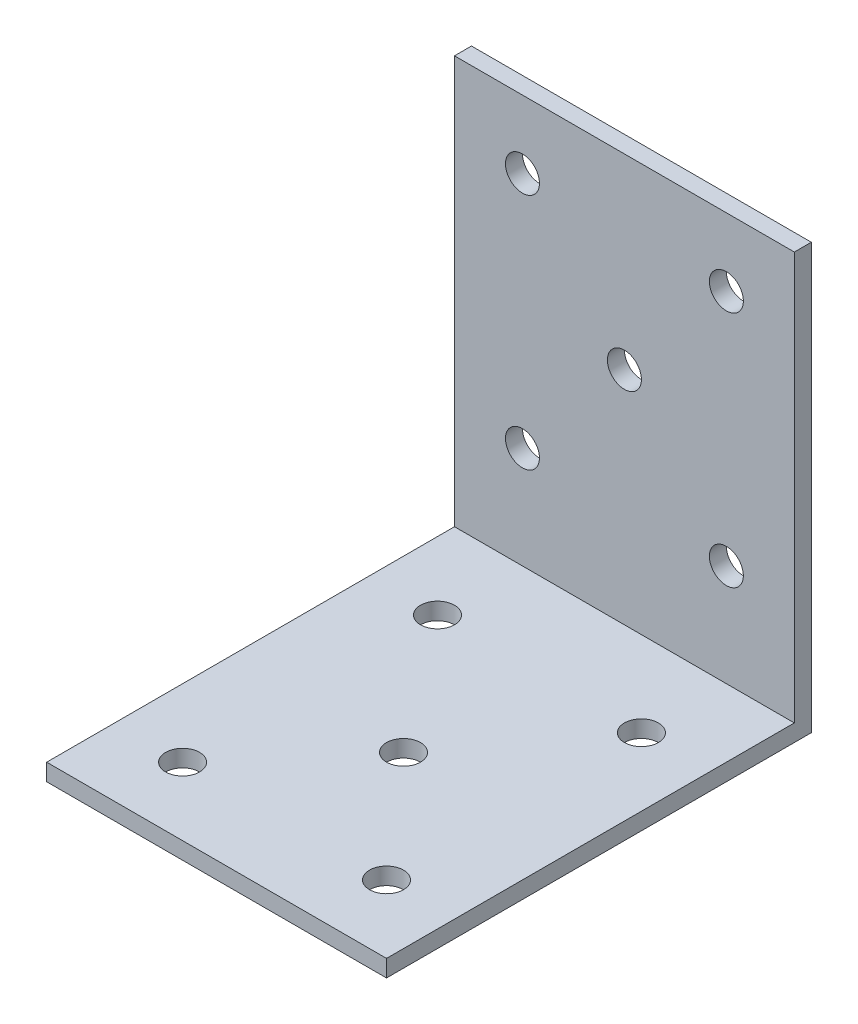
ISO-10303-21;
HEADER;
FILE_DESCRIPTION(('STEP AP214'),'2;1');
FILE_NAME('part.step','',(''),(''),'','','');
FILE_SCHEMA(('AUTOMOTIVE_DESIGN { 1 0 10303 214 1 1 1 1 }'));
ENDSEC;
DATA;
#1=APPLICATION_CONTEXT('core data for automotive mechanical design processes');
#2=APPLICATION_PROTOCOL_DEFINITION('international standard','automotive_design',2000,#1);
#3=PRODUCT_CONTEXT('',#1,'mechanical');
#4=PRODUCT('Part','Part','',(#3));
#5=PRODUCT_RELATED_PRODUCT_CATEGORY('part','',(#4));
#6=PRODUCT_DEFINITION_FORMATION('','',#4);
#7=PRODUCT_DEFINITION_CONTEXT('part definition',#1,'design');
#8=PRODUCT_DEFINITION('design','',#6,#7);
#9=PRODUCT_DEFINITION_SHAPE('','',#8);
#10=(LENGTH_UNIT() NAMED_UNIT(*) SI_UNIT(.MILLI.,.METRE.));
#11=(NAMED_UNIT(*) PLANE_ANGLE_UNIT() SI_UNIT($,.RADIAN.));
#12=(NAMED_UNIT(*) SI_UNIT($,.STERADIAN.) SOLID_ANGLE_UNIT());
#13=UNCERTAINTY_MEASURE_WITH_UNIT(LENGTH_MEASURE(1.E-05),#10,'distance_accuracy_value','');
#14=(GEOMETRIC_REPRESENTATION_CONTEXT(3) GLOBAL_UNCERTAINTY_ASSIGNED_CONTEXT((#13)) GLOBAL_UNIT_ASSIGNED_CONTEXT((#10,
#11,#12)) REPRESENTATION_CONTEXT('',''));
#15=CARTESIAN_POINT('',(0.,0.,0.));
#16=DIRECTION('',(0.,0.,1.));
#17=DIRECTION('',(1.,0.,0.));
#18=AXIS2_PLACEMENT_3D('',#15,#16,#17);
#19=CARTESIAN_POINT('',(0.,2.,0.));
#20=DIRECTION('',(0.,1.,0.));
#21=DIRECTION('',(0.,0.,1.));
#22=AXIS2_PLACEMENT_3D('',#19,#20,#21);
#23=PLANE('',#22);
#24=CARTESIAN_POINT('',(12.,2.,-16.));
#25=DIRECTION('',(0.,1.,0.));
#26=DIRECTION('',(0.,0.,1.));
#27=AXIS2_PLACEMENT_3D('',#24,#25,#26);
#28=CIRCLE('',#27,2.);
#29=CARTESIAN_POINT('',(12.,2.,-14.));
#30=VERTEX_POINT('',#29);
#31=EDGE_CURVE('E129',#30,#30,#28,.T.);
#32=ORIENTED_EDGE('',*,*,#31,.F.);
#33=EDGE_LOOP('',(#32));
#34=FACE_BOUND('',#33,.T.);
#35=CARTESIAN_POINT('',(-12.,2.,14.));
#36=DIRECTION('',(0.,1.,0.));
#37=DIRECTION('',(0.,0.,1.));
#38=AXIS2_PLACEMENT_3D('',#35,#36,#37);
#39=CIRCLE('',#38,2.);
#40=CARTESIAN_POINT('',(-12.,2.,16.));
#41=VERTEX_POINT('',#40);
#42=EDGE_CURVE('E141',#41,#41,#39,.T.);
#43=ORIENTED_EDGE('',*,*,#42,.F.);
#44=EDGE_LOOP('',(#43));
#45=FACE_BOUND('',#44,.T.);
#46=CARTESIAN_POINT('',(0.,2.,0.));
#47=DIRECTION('',(0.,1.,0.));
#48=DIRECTION('',(0.,0.,1.));
#49=AXIS2_PLACEMENT_3D('',#46,#47,#48);
#50=CIRCLE('',#49,2.);
#51=CARTESIAN_POINT('',(0.,2.,2.));
#52=VERTEX_POINT('',#51);
#53=EDGE_CURVE('E147',#52,#52,#50,.T.);
#54=ORIENTED_EDGE('',*,*,#53,.F.);
#55=EDGE_LOOP('',(#54));
#56=FACE_BOUND('',#55,.T.);
#57=CARTESIAN_POINT('',(-12.,2.,-16.));
#58=DIRECTION('',(0.,1.,0.));
#59=DIRECTION('',(0.,0.,1.));
#60=AXIS2_PLACEMENT_3D('',#57,#58,#59);
#61=CIRCLE('',#60,2.);
#62=CARTESIAN_POINT('',(-12.,2.,-14.));
#63=VERTEX_POINT('',#62);
#64=EDGE_CURVE('E135',#63,#63,#61,.T.);
#65=ORIENTED_EDGE('',*,*,#64,.F.);
#66=EDGE_LOOP('',(#65));
#67=FACE_BOUND('',#66,.T.);
#68=CARTESIAN_POINT('',(12.,2.,14.));
#69=DIRECTION('',(0.,1.,0.));
#70=DIRECTION('',(0.,0.,1.));
#71=AXIS2_PLACEMENT_3D('',#68,#69,#70);
#72=CIRCLE('',#71,2.);
#73=CARTESIAN_POINT('',(12.,2.,16.));
#74=VERTEX_POINT('',#73);
#75=EDGE_CURVE('E123',#74,#74,#72,.T.);
#76=ORIENTED_EDGE('',*,*,#75,.F.);
#77=EDGE_LOOP('',(#76));
#78=FACE_BOUND('',#77,.T.);
#79=DIRECTION('',(0.,0.,-1.));
#80=VECTOR('',#79,1.);
#81=CARTESIAN_POINT('',(20.,2.,-28.));
#82=LINE('',#81,#80);
#83=CARTESIAN_POINT('',(20.,2.,22.));
#84=VERTEX_POINT('',#83);
#85=CARTESIAN_POINT('',(20.,2.,-26.));
#86=VERTEX_POINT('',#85);
#87=EDGE_CURVE('E59',#84,#86,#82,.T.);
#88=ORIENTED_EDGE('',*,*,#87,.T.);
#89=DIRECTION('',(-1.,0.,0.));
#90=VECTOR('',#89,1.);
#91=CARTESIAN_POINT('',(0.,2.,-26.));
#92=LINE('',#91,#90);
#93=CARTESIAN_POINT('',(-20.,2.,-26.));
#94=VERTEX_POINT('',#93);
#95=EDGE_CURVE('E54',#86,#94,#92,.T.);
#96=ORIENTED_EDGE('',*,*,#95,.T.);
#97=DIRECTION('',(0.,0.,1.));
#98=VECTOR('',#97,1.);
#99=CARTESIAN_POINT('',(-20.,2.,-28.));
#100=LINE('',#99,#98);
#101=CARTESIAN_POINT('',(-20.,2.,22.));
#102=VERTEX_POINT('',#101);
#103=EDGE_CURVE('E96',#94,#102,#100,.T.);
#104=ORIENTED_EDGE('',*,*,#103,.T.);
#105=DIRECTION('',(1.,0.,0.));
#106=VECTOR('',#105,1.);
#107=CARTESIAN_POINT('',(-20.,2.,22.));
#108=LINE('',#107,#106);
#109=EDGE_CURVE('E154',#102,#84,#108,.T.);
#110=ORIENTED_EDGE('',*,*,#109,.T.);
#111=EDGE_LOOP('',(#88,#96,#104,#110));
#112=FACE_BOUND('',#111,.T.);
#113=ADVANCED_FACE('F39',(#34,#45,#56,#67,#78,#112),#23,.T.);
#114=CARTESIAN_POINT('',(0.,0.,0.));
#115=DIRECTION('',(0.,1.,0.));
#116=DIRECTION('',(0.,0.,1.));
#117=AXIS2_PLACEMENT_3D('',#114,#115,#116);
#118=PLANE('',#117);
#119=DIRECTION('',(-1.,0.,0.));
#120=VECTOR('',#119,1.);
#121=CARTESIAN_POINT('',(-20.,0.,-28.));
#122=LINE('',#121,#120);
#123=CARTESIAN_POINT('',(20.,0.,-28.));
#124=VERTEX_POINT('',#123);
#125=CARTESIAN_POINT('',(-20.,0.,-28.));
#126=VERTEX_POINT('',#125);
#127=EDGE_CURVE('E155',#124,#126,#122,.T.);
#128=ORIENTED_EDGE('',*,*,#127,.F.);
#129=DIRECTION('',(0.,0.,-1.));
#130=VECTOR('',#129,1.);
#131=CARTESIAN_POINT('',(20.,0.,-28.));
#132=LINE('',#131,#130);
#133=CARTESIAN_POINT('',(20.,0.,22.));
#134=VERTEX_POINT('',#133);
#135=EDGE_CURVE('E162',#134,#124,#132,.T.);
#136=ORIENTED_EDGE('',*,*,#135,.F.);
#137=DIRECTION('',(1.,0.,0.));
#138=VECTOR('',#137,1.);
#139=CARTESIAN_POINT('',(-20.,0.,22.));
#140=LINE('',#139,#138);
#141=CARTESIAN_POINT('',(-20.,0.,22.));
#142=VERTEX_POINT('',#141);
#143=EDGE_CURVE('E160',#142,#134,#140,.T.);
#144=ORIENTED_EDGE('',*,*,#143,.F.);
#145=DIRECTION('',(0.,0.,1.));
#146=VECTOR('',#145,1.);
#147=CARTESIAN_POINT('',(-20.,0.,-28.));
#148=LINE('',#147,#146);
#149=EDGE_CURVE('E150',#126,#142,#148,.T.);
#150=ORIENTED_EDGE('',*,*,#149,.F.);
#151=EDGE_LOOP('',(#128,#136,#144,#150));
#152=FACE_BOUND('',#151,.T.);
#153=CARTESIAN_POINT('',(12.,0.,14.));
#154=DIRECTION('',(0.,1.,0.));
#155=DIRECTION('',(0.,0.,1.));
#156=AXIS2_PLACEMENT_3D('',#153,#154,#155);
#157=CIRCLE('',#156,2.);
#158=CARTESIAN_POINT('',(12.,0.,16.));
#159=VERTEX_POINT('',#158);
#160=EDGE_CURVE('E122',#159,#159,#157,.T.);
#161=ORIENTED_EDGE('',*,*,#160,.T.);
#162=EDGE_LOOP('',(#161));
#163=FACE_BOUND('',#162,.T.);
#164=CARTESIAN_POINT('',(12.,0.,-16.));
#165=DIRECTION('',(0.,1.,0.));
#166=DIRECTION('',(0.,0.,1.));
#167=AXIS2_PLACEMENT_3D('',#164,#165,#166);
#168=CIRCLE('',#167,2.);
#169=CARTESIAN_POINT('',(12.,0.,-14.));
#170=VERTEX_POINT('',#169);
#171=EDGE_CURVE('E126',#170,#170,#168,.T.);
#172=ORIENTED_EDGE('',*,*,#171,.T.);
#173=EDGE_LOOP('',(#172));
#174=FACE_BOUND('',#173,.T.);
#175=CARTESIAN_POINT('',(-12.,0.,-16.));
#176=DIRECTION('',(0.,1.,0.));
#177=DIRECTION('',(0.,0.,1.));
#178=AXIS2_PLACEMENT_3D('',#175,#176,#177);
#179=CIRCLE('',#178,2.);
#180=CARTESIAN_POINT('',(-12.,0.,-14.));
#181=VERTEX_POINT('',#180);
#182=EDGE_CURVE('E132',#181,#181,#179,.T.);
#183=ORIENTED_EDGE('',*,*,#182,.T.);
#184=EDGE_LOOP('',(#183));
#185=FACE_BOUND('',#184,.T.);
#186=CARTESIAN_POINT('',(-12.,0.,14.));
#187=DIRECTION('',(0.,1.,0.));
#188=DIRECTION('',(0.,0.,1.));
#189=AXIS2_PLACEMENT_3D('',#186,#187,#188);
#190=CIRCLE('',#189,2.);
#191=CARTESIAN_POINT('',(-12.,0.,16.));
#192=VERTEX_POINT('',#191);
#193=EDGE_CURVE('E138',#192,#192,#190,.T.);
#194=ORIENTED_EDGE('',*,*,#193,.T.);
#195=EDGE_LOOP('',(#194));
#196=FACE_BOUND('',#195,.T.);
#197=CARTESIAN_POINT('',(0.,0.,0.));
#198=DIRECTION('',(0.,1.,0.));
#199=DIRECTION('',(0.,0.,1.));
#200=AXIS2_PLACEMENT_3D('',#197,#198,#199);
#201=CIRCLE('',#200,2.);
#202=CARTESIAN_POINT('',(0.,0.,2.));
#203=VERTEX_POINT('',#202);
#204=EDGE_CURVE('E144',#203,#203,#201,.T.);
#205=ORIENTED_EDGE('',*,*,#204,.T.);
#206=EDGE_LOOP('',(#205));
#207=FACE_BOUND('',#206,.T.);
#208=ADVANCED_FACE('F178',(#152,#163,#174,#185,#196,#207),#118,.F.);
#209=CARTESIAN_POINT('',(-20.,2.,-28.));
#210=DIRECTION('',(1.,0.,0.));
#211=DIRECTION('',(0.,0.,-1.));
#212=AXIS2_PLACEMENT_3D('',#209,#210,#211);
#213=PLANE('',#212);
#214=ORIENTED_EDGE('',*,*,#149,.T.);
#215=DIRECTION('',(0.,-1.,0.));
#216=VECTOR('',#215,1.);
#217=CARTESIAN_POINT('',(-20.,2.,22.));
#218=LINE('',#217,#216);
#219=EDGE_CURVE('E11',#102,#142,#218,.T.);
#220=ORIENTED_EDGE('',*,*,#219,.F.);
#221=ORIENTED_EDGE('',*,*,#103,.F.);
#222=DIRECTION('',(0.,1.,0.));
#223=VECTOR('',#222,1.);
#224=CARTESIAN_POINT('',(-20.,0.,-26.));
#225=LINE('',#224,#223);
#226=CARTESIAN_POINT('',(-20.,50.,-26.));
#227=VERTEX_POINT('',#226);
#228=EDGE_CURVE('E90',#94,#227,#225,.T.);
#229=ORIENTED_EDGE('',*,*,#228,.T.);
#230=DIRECTION('',(0.,0.,-1.));
#231=VECTOR('',#230,1.);
#232=CARTESIAN_POINT('',(-20.,50.,-26.));
#233=LINE('',#232,#231);
#234=CARTESIAN_POINT('',(-20.,50.,-28.));
#235=VERTEX_POINT('',#234);
#236=EDGE_CURVE('E93',#227,#235,#233,.T.);
#237=ORIENTED_EDGE('',*,*,#236,.T.);
#238=DIRECTION('',(0.,-1.,0.));
#239=VECTOR('',#238,1.);
#240=CARTESIAN_POINT('',(-20.,2.,-28.));
#241=LINE('',#240,#239);
#242=EDGE_CURVE('E158',#235,#126,#241,.T.);
#243=ORIENTED_EDGE('',*,*,#242,.T.);
#244=EDGE_LOOP('',(#214,#220,#221,#229,#237,#243));
#245=FACE_BOUND('',#244,.T.);
#246=ADVANCED_FACE('F41',(#245),#213,.F.);
#247=CARTESIAN_POINT('',(-20.,2.,22.));
#248=DIRECTION('',(0.,0.,-1.));
#249=DIRECTION('',(-1.,0.,0.));
#250=AXIS2_PLACEMENT_3D('',#247,#248,#249);
#251=PLANE('',#250);
#252=ORIENTED_EDGE('',*,*,#143,.T.);
#253=DIRECTION('',(0.,-1.,0.));
#254=VECTOR('',#253,1.);
#255=CARTESIAN_POINT('',(20.,2.,22.));
#256=LINE('',#255,#254);
#257=EDGE_CURVE('E47',#84,#134,#256,.T.);
#258=ORIENTED_EDGE('',*,*,#257,.F.);
#259=ORIENTED_EDGE('',*,*,#109,.F.);
#260=ORIENTED_EDGE('',*,*,#219,.T.);
#261=EDGE_LOOP('',(#252,#258,#259,#260));
#262=FACE_BOUND('',#261,.T.);
#263=ADVANCED_FACE('F184',(#262),#251,.F.);
#264=CARTESIAN_POINT('',(20.,2.,-28.));
#265=DIRECTION('',(-1.,0.,0.));
#266=DIRECTION('',(0.,0.,1.));
#267=AXIS2_PLACEMENT_3D('',#264,#265,#266);
#268=PLANE('',#267);
#269=DIRECTION('',(0.,-1.,0.));
#270=VECTOR('',#269,1.);
#271=CARTESIAN_POINT('',(20.,2.,-28.));
#272=LINE('',#271,#270);
#273=CARTESIAN_POINT('',(20.,50.,-28.));
#274=VERTEX_POINT('',#273);
#275=EDGE_CURVE('E166',#274,#124,#272,.T.);
#276=ORIENTED_EDGE('',*,*,#275,.F.);
#277=DIRECTION('',(0.,0.,-1.));
#278=VECTOR('',#277,1.);
#279=CARTESIAN_POINT('',(20.,50.,-26.));
#280=LINE('',#279,#278);
#281=CARTESIAN_POINT('',(20.,50.,-26.));
#282=VERTEX_POINT('',#281);
#283=EDGE_CURVE('E107',#282,#274,#280,.T.);
#284=ORIENTED_EDGE('',*,*,#283,.F.);
#285=DIRECTION('',(0.,-1.,0.));
#286=VECTOR('',#285,1.);
#287=CARTESIAN_POINT('',(20.,0.,-26.));
#288=LINE('',#287,#286);
#289=EDGE_CURVE('E108',#282,#86,#288,.T.);
#290=ORIENTED_EDGE('',*,*,#289,.T.);
#291=ORIENTED_EDGE('',*,*,#87,.F.);
#292=ORIENTED_EDGE('',*,*,#257,.T.);
#293=ORIENTED_EDGE('',*,*,#135,.T.);
#294=EDGE_LOOP('',(#276,#284,#290,#291,#292,#293));
#295=FACE_BOUND('',#294,.T.);
#296=ADVANCED_FACE('F172',(#295),#268,.F.);
#297=CARTESIAN_POINT('',(-20.,2.,-28.));
#298=DIRECTION('',(0.,0.,1.));
#299=DIRECTION('',(1.,0.,0.));
#300=AXIS2_PLACEMENT_3D('',#297,#298,#299);
#301=PLANE('',#300);
#302=ORIENTED_EDGE('',*,*,#127,.T.);
#303=ORIENTED_EDGE('',*,*,#242,.F.);
#304=DIRECTION('',(1.,0.,0.));
#305=VECTOR('',#304,1.);
#306=CARTESIAN_POINT('',(-20.,50.,-28.));
#307=LINE('',#306,#305);
#308=EDGE_CURVE('E100',#235,#274,#307,.T.);
#309=ORIENTED_EDGE('',*,*,#308,.T.);
#310=ORIENTED_EDGE('',*,*,#275,.T.);
#311=EDGE_LOOP('',(#302,#303,#309,#310));
#312=FACE_BOUND('',#311,.T.);
#313=CARTESIAN_POINT('',(-12.,14.,-28.));
#314=DIRECTION('',(0.,0.,-1.));
#315=DIRECTION('',(-1.,0.,0.));
#316=AXIS2_PLACEMENT_3D('',#313,#314,#315);
#317=CIRCLE('',#316,2.);
#318=CARTESIAN_POINT('',(-14.,14.,-28.));
#319=VERTEX_POINT('',#318);
#320=EDGE_CURVE('E386',#319,#319,#317,.T.);
#321=ORIENTED_EDGE('',*,*,#320,.F.);
#322=EDGE_LOOP('',(#321));
#323=FACE_BOUND('',#322,.T.);
#324=CARTESIAN_POINT('',(12.,14.,-28.));
#325=DIRECTION('',(0.,0.,-1.));
#326=DIRECTION('',(-1.,0.,0.));
#327=AXIS2_PLACEMENT_3D('',#324,#325,#326);
#328=CIRCLE('',#327,2.);
#329=CARTESIAN_POINT('',(10.,14.,-28.));
#330=VERTEX_POINT('',#329);
#331=EDGE_CURVE('E388',#330,#330,#328,.T.);
#332=ORIENTED_EDGE('',*,*,#331,.F.);
#333=EDGE_LOOP('',(#332));
#334=FACE_BOUND('',#333,.T.);
#335=CARTESIAN_POINT('',(12.,42.,-28.));
#336=DIRECTION('',(0.,0.,-1.));
#337=DIRECTION('',(-1.,0.,0.));
#338=AXIS2_PLACEMENT_3D('',#335,#336,#337);
#339=CIRCLE('',#338,2.);
#340=CARTESIAN_POINT('',(10.,42.,-28.));
#341=VERTEX_POINT('',#340);
#342=EDGE_CURVE('E394',#341,#341,#339,.T.);
#343=ORIENTED_EDGE('',*,*,#342,.F.);
#344=EDGE_LOOP('',(#343));
#345=FACE_BOUND('',#344,.T.);
#346=CARTESIAN_POINT('',(-12.,42.,-28.));
#347=DIRECTION('',(0.,0.,-1.));
#348=DIRECTION('',(-1.,0.,0.));
#349=AXIS2_PLACEMENT_3D('',#346,#347,#348);
#350=CIRCLE('',#349,2.);
#351=CARTESIAN_POINT('',(-14.,42.,-28.));
#352=VERTEX_POINT('',#351);
#353=EDGE_CURVE('E400',#352,#352,#350,.T.);
#354=ORIENTED_EDGE('',*,*,#353,.F.);
#355=EDGE_LOOP('',(#354));
#356=FACE_BOUND('',#355,.T.);
#357=CARTESIAN_POINT('',(0.,28.,-28.));
#358=DIRECTION('',(0.,0.,-1.));
#359=DIRECTION('',(-1.,0.,0.));
#360=AXIS2_PLACEMENT_3D('',#357,#358,#359);
#361=CIRCLE('',#360,2.);
#362=CARTESIAN_POINT('',(-2.,28.,-28.));
#363=VERTEX_POINT('',#362);
#364=EDGE_CURVE('E406',#363,#363,#361,.T.);
#365=ORIENTED_EDGE('',*,*,#364,.F.);
#366=EDGE_LOOP('',(#365));
#367=FACE_BOUND('',#366,.T.);
#368=ADVANCED_FACE('F182',(#312,#323,#334,#345,#356,#367),#301,.F.);
#369=CARTESIAN_POINT('',(0.,2.,0.));
#370=DIRECTION('',(0.,-1.,0.));
#371=DIRECTION('',(0.,0.,-1.));
#372=AXIS2_PLACEMENT_3D('',#369,#370,#371);
#373=CYLINDRICAL_SURFACE('',#372,2.);
#374=ORIENTED_EDGE('',*,*,#53,.T.);
#375=EDGE_LOOP('',(#374));
#376=FACE_BOUND('',#375,.T.);
#377=ORIENTED_EDGE('',*,*,#204,.F.);
#378=EDGE_LOOP('',(#377));
#379=FACE_BOUND('',#378,.T.);
#380=ADVANCED_FACE('F196',(#376,#379),#373,.F.);
#381=CARTESIAN_POINT('',(-12.,2.,14.));
#382=DIRECTION('',(0.,-1.,0.));
#383=DIRECTION('',(0.,0.,-1.));
#384=AXIS2_PLACEMENT_3D('',#381,#382,#383);
#385=CYLINDRICAL_SURFACE('',#384,2.);
#386=ORIENTED_EDGE('',*,*,#42,.T.);
#387=EDGE_LOOP('',(#386));
#388=FACE_BOUND('',#387,.T.);
#389=ORIENTED_EDGE('',*,*,#193,.F.);
#390=EDGE_LOOP('',(#389));
#391=FACE_BOUND('',#390,.T.);
#392=ADVANCED_FACE('F317',(#388,#391),#385,.F.);
#393=CARTESIAN_POINT('',(-12.,2.,-16.));
#394=DIRECTION('',(0.,-1.,0.));
#395=DIRECTION('',(0.,0.,-1.));
#396=AXIS2_PLACEMENT_3D('',#393,#394,#395);
#397=CYLINDRICAL_SURFACE('',#396,2.);
#398=ORIENTED_EDGE('',*,*,#64,.T.);
#399=EDGE_LOOP('',(#398));
#400=FACE_BOUND('',#399,.T.);
#401=ORIENTED_EDGE('',*,*,#182,.F.);
#402=EDGE_LOOP('',(#401));
#403=FACE_BOUND('',#402,.T.);
#404=ADVANCED_FACE('F308',(#400,#403),#397,.F.);
#405=CARTESIAN_POINT('',(12.,2.,-16.));
#406=DIRECTION('',(0.,-1.,0.));
#407=DIRECTION('',(0.,0.,-1.));
#408=AXIS2_PLACEMENT_3D('',#405,#406,#407);
#409=CYLINDRICAL_SURFACE('',#408,2.);
#410=ORIENTED_EDGE('',*,*,#31,.T.);
#411=EDGE_LOOP('',(#410));
#412=FACE_BOUND('',#411,.T.);
#413=ORIENTED_EDGE('',*,*,#171,.F.);
#414=EDGE_LOOP('',(#413));
#415=FACE_BOUND('',#414,.T.);
#416=ADVANCED_FACE('F299',(#412,#415),#409,.F.);
#417=CARTESIAN_POINT('',(12.,2.,14.));
#418=DIRECTION('',(0.,-1.,0.));
#419=DIRECTION('',(0.,0.,-1.));
#420=AXIS2_PLACEMENT_3D('',#417,#418,#419);
#421=CYLINDRICAL_SURFACE('',#420,2.);
#422=ORIENTED_EDGE('',*,*,#75,.T.);
#423=EDGE_LOOP('',(#422));
#424=FACE_BOUND('',#423,.T.);
#425=ORIENTED_EDGE('',*,*,#160,.F.);
#426=EDGE_LOOP('',(#425));
#427=FACE_BOUND('',#426,.T.);
#428=ADVANCED_FACE('F229',(#424,#427),#421,.F.);
#429=CARTESIAN_POINT('',(-20.,50.,-26.));
#430=DIRECTION('',(0.,1.,0.));
#431=DIRECTION('',(0.,0.,1.));
#432=AXIS2_PLACEMENT_3D('',#429,#430,#431);
#433=PLANE('',#432);
#434=ORIENTED_EDGE('',*,*,#308,.F.);
#435=ORIENTED_EDGE('',*,*,#236,.F.);
#436=DIRECTION('',(1.,0.,0.));
#437=VECTOR('',#436,1.);
#438=CARTESIAN_POINT('',(-20.,50.,-26.));
#439=LINE('',#438,#437);
#440=EDGE_CURVE('E99',#227,#282,#439,.T.);
#441=ORIENTED_EDGE('',*,*,#440,.T.);
#442=ORIENTED_EDGE('',*,*,#283,.T.);
#443=EDGE_LOOP('',(#434,#435,#441,#442));
#444=FACE_BOUND('',#443,.T.);
#445=ADVANCED_FACE('F104',(#444),#433,.T.);
#446=CARTESIAN_POINT('',(0.,0.,-26.));
#447=DIRECTION('',(0.,0.,-1.));
#448=DIRECTION('',(-1.,0.,0.));
#449=AXIS2_PLACEMENT_3D('',#446,#447,#448);
#450=PLANE('',#449);
#451=ORIENTED_EDGE('',*,*,#95,.F.);
#452=ORIENTED_EDGE('',*,*,#289,.F.);
#453=ORIENTED_EDGE('',*,*,#440,.F.);
#454=ORIENTED_EDGE('',*,*,#228,.F.);
#455=EDGE_LOOP('',(#451,#452,#453,#454));
#456=FACE_BOUND('',#455,.T.);
#457=CARTESIAN_POINT('',(-12.,14.,-26.));
#458=DIRECTION('',(0.,0.,-1.));
#459=DIRECTION('',(-1.,0.,0.));
#460=AXIS2_PLACEMENT_3D('',#457,#458,#459);
#461=CIRCLE('',#460,2.);
#462=CARTESIAN_POINT('',(-14.,14.,-26.));
#463=VERTEX_POINT('',#462);
#464=EDGE_CURVE('E383',#463,#463,#461,.T.);
#465=ORIENTED_EDGE('',*,*,#464,.T.);
#466=EDGE_LOOP('',(#465));
#467=FACE_BOUND('',#466,.T.);
#468=CARTESIAN_POINT('',(12.,14.,-26.));
#469=DIRECTION('',(0.,0.,-1.));
#470=DIRECTION('',(-1.,0.,0.));
#471=AXIS2_PLACEMENT_3D('',#468,#469,#470);
#472=CIRCLE('',#471,2.);
#473=CARTESIAN_POINT('',(10.,14.,-26.));
#474=VERTEX_POINT('',#473);
#475=EDGE_CURVE('E391',#474,#474,#472,.T.);
#476=ORIENTED_EDGE('',*,*,#475,.T.);
#477=EDGE_LOOP('',(#476));
#478=FACE_BOUND('',#477,.T.);
#479=CARTESIAN_POINT('',(12.,42.,-26.));
#480=DIRECTION('',(0.,0.,-1.));
#481=DIRECTION('',(-1.,0.,0.));
#482=AXIS2_PLACEMENT_3D('',#479,#480,#481);
#483=CIRCLE('',#482,2.);
#484=CARTESIAN_POINT('',(10.,42.,-26.));
#485=VERTEX_POINT('',#484);
#486=EDGE_CURVE('E397',#485,#485,#483,.T.);
#487=ORIENTED_EDGE('',*,*,#486,.T.);
#488=EDGE_LOOP('',(#487));
#489=FACE_BOUND('',#488,.T.);
#490=CARTESIAN_POINT('',(-12.,42.,-26.));
#491=DIRECTION('',(0.,0.,-1.));
#492=DIRECTION('',(-1.,0.,0.));
#493=AXIS2_PLACEMENT_3D('',#490,#491,#492);
#494=CIRCLE('',#493,2.);
#495=CARTESIAN_POINT('',(-14.,42.,-26.));
#496=VERTEX_POINT('',#495);
#497=EDGE_CURVE('E403',#496,#496,#494,.T.);
#498=ORIENTED_EDGE('',*,*,#497,.T.);
#499=EDGE_LOOP('',(#498));
#500=FACE_BOUND('',#499,.T.);
#501=CARTESIAN_POINT('',(0.,28.,-26.));
#502=DIRECTION('',(0.,0.,-1.));
#503=DIRECTION('',(-1.,0.,0.));
#504=AXIS2_PLACEMENT_3D('',#501,#502,#503);
#505=CIRCLE('',#504,2.);
#506=CARTESIAN_POINT('',(-2.,28.,-26.));
#507=VERTEX_POINT('',#506);
#508=EDGE_CURVE('E119',#507,#507,#505,.T.);
#509=ORIENTED_EDGE('',*,*,#508,.T.);
#510=EDGE_LOOP('',(#509));
#511=FACE_BOUND('',#510,.T.);
#512=ADVANCED_FACE('F111',(#456,#467,#478,#489,#500,#511),#450,.F.);
#513=CARTESIAN_POINT('',(0.,28.,-26.));
#514=DIRECTION('',(0.,0.,-1.));
#515=DIRECTION('',(-1.,0.,0.));
#516=AXIS2_PLACEMENT_3D('',#513,#514,#515);
#517=CYLINDRICAL_SURFACE('',#516,2.);
#518=ORIENTED_EDGE('',*,*,#508,.F.);
#519=EDGE_LOOP('',(#518));
#520=FACE_BOUND('',#519,.T.);
#521=ORIENTED_EDGE('',*,*,#364,.T.);
#522=EDGE_LOOP('',(#521));
#523=FACE_BOUND('',#522,.T.);
#524=ADVANCED_FACE('F237',(#520,#523),#517,.F.);
#525=CARTESIAN_POINT('',(-12.,42.,-26.));
#526=DIRECTION('',(0.,0.,-1.));
#527=DIRECTION('',(-1.,0.,0.));
#528=AXIS2_PLACEMENT_3D('',#525,#526,#527);
#529=CYLINDRICAL_SURFACE('',#528,2.);
#530=ORIENTED_EDGE('',*,*,#497,.F.);
#531=EDGE_LOOP('',(#530));
#532=FACE_BOUND('',#531,.T.);
#533=ORIENTED_EDGE('',*,*,#353,.T.);
#534=EDGE_LOOP('',(#533));
#535=FACE_BOUND('',#534,.T.);
#536=ADVANCED_FACE('F245',(#532,#535),#529,.F.);
#537=CARTESIAN_POINT('',(12.,42.,-26.));
#538=DIRECTION('',(0.,0.,-1.));
#539=DIRECTION('',(-1.,0.,0.));
#540=AXIS2_PLACEMENT_3D('',#537,#538,#539);
#541=CYLINDRICAL_SURFACE('',#540,2.);
#542=ORIENTED_EDGE('',*,*,#486,.F.);
#543=EDGE_LOOP('',(#542));
#544=FACE_BOUND('',#543,.T.);
#545=ORIENTED_EDGE('',*,*,#342,.T.);
#546=EDGE_LOOP('',(#545));
#547=FACE_BOUND('',#546,.T.);
#548=ADVANCED_FACE('F254',(#544,#547),#541,.F.);
#549=CARTESIAN_POINT('',(12.,14.,-26.));
#550=DIRECTION('',(0.,0.,-1.));
#551=DIRECTION('',(-1.,0.,0.));
#552=AXIS2_PLACEMENT_3D('',#549,#550,#551);
#553=CYLINDRICAL_SURFACE('',#552,2.);
#554=ORIENTED_EDGE('',*,*,#475,.F.);
#555=EDGE_LOOP('',(#554));
#556=FACE_BOUND('',#555,.T.);
#557=ORIENTED_EDGE('',*,*,#331,.T.);
#558=EDGE_LOOP('',(#557));
#559=FACE_BOUND('',#558,.T.);
#560=ADVANCED_FACE('F263',(#556,#559),#553,.F.);
#561=CARTESIAN_POINT('',(-12.,14.,-26.));
#562=DIRECTION('',(0.,0.,-1.));
#563=DIRECTION('',(-1.,0.,0.));
#564=AXIS2_PLACEMENT_3D('',#561,#562,#563);
#565=CYLINDRICAL_SURFACE('',#564,2.);
#566=ORIENTED_EDGE('',*,*,#464,.F.);
#567=EDGE_LOOP('',(#566));
#568=FACE_BOUND('',#567,.T.);
#569=ORIENTED_EDGE('',*,*,#320,.T.);
#570=EDGE_LOOP('',(#569));
#571=FACE_BOUND('',#570,.T.);
#572=ADVANCED_FACE('F272',(#568,#571),#565,.F.);
#573=CLOSED_SHELL('',(#113,#208,#246,#263,#296,#368,#380,#392,#404,#416,#428,#445,#512,#524,
#536,#548,#560,#572));
#574=MANIFOLD_SOLID_BREP('B2',#573);
#575=ADVANCED_BREP_SHAPE_REPRESENTATION('',(#18,#574),#14);
#576=SHAPE_DEFINITION_REPRESENTATION(#9,#575);
ENDSEC;
END-ISO-10303-21;
